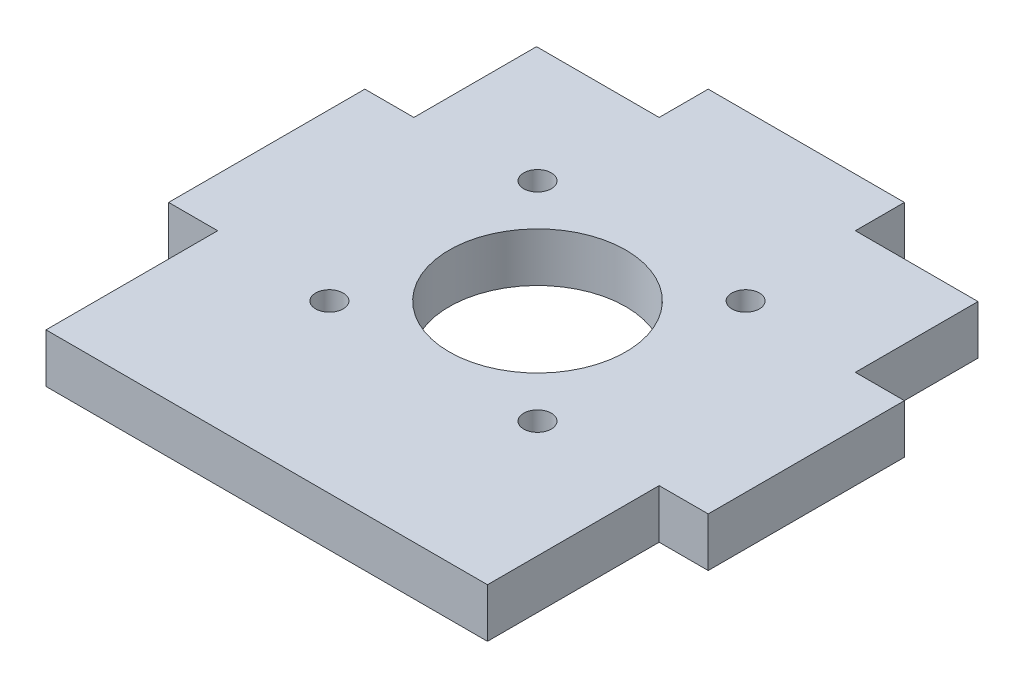
ISO-10303-21;
HEADER;
FILE_DESCRIPTION(('STEP AP214'),'2;1');
FILE_NAME('part.step','',(''),(''),'','','');
FILE_SCHEMA(('AUTOMOTIVE_DESIGN { 1 0 10303 214 1 1 1 1 }'));
ENDSEC;
DATA;
#1=APPLICATION_CONTEXT('core data for automotive mechanical design processes');
#2=APPLICATION_PROTOCOL_DEFINITION('international standard','automotive_design',2000,#1);
#3=PRODUCT_CONTEXT('',#1,'mechanical');
#4=PRODUCT('Part','Part','',(#3));
#5=PRODUCT_RELATED_PRODUCT_CATEGORY('part','',(#4));
#6=PRODUCT_DEFINITION_FORMATION('','',#4);
#7=PRODUCT_DEFINITION_CONTEXT('part definition',#1,'design');
#8=PRODUCT_DEFINITION('design','',#6,#7);
#9=PRODUCT_DEFINITION_SHAPE('','',#8);
#10=(LENGTH_UNIT() NAMED_UNIT(*) SI_UNIT(.MILLI.,.METRE.));
#11=(NAMED_UNIT(*) PLANE_ANGLE_UNIT() SI_UNIT($,.RADIAN.));
#12=(NAMED_UNIT(*) SI_UNIT($,.STERADIAN.) SOLID_ANGLE_UNIT());
#13=UNCERTAINTY_MEASURE_WITH_UNIT(LENGTH_MEASURE(1.E-05),#10,'distance_accuracy_value','');
#14=(GEOMETRIC_REPRESENTATION_CONTEXT(3) GLOBAL_UNCERTAINTY_ASSIGNED_CONTEXT((#13)) GLOBAL_UNIT_ASSIGNED_CONTEXT((#10,
#11,#12)) REPRESENTATION_CONTEXT('',''));
#15=CARTESIAN_POINT('',(0.,0.,0.));
#16=DIRECTION('',(0.,0.,1.));
#17=DIRECTION('',(1.,0.,0.));
#18=AXIS2_PLACEMENT_3D('',#15,#16,#17);
#19=CARTESIAN_POINT('',(6.35,6.35,-47.625));
#20=DIRECTION('',(0.,-1.,0.));
#21=DIRECTION('',(0.,0.,-1.));
#22=AXIS2_PLACEMENT_3D('',#19,#20,#21);
#23=PLANE('',#22);
#24=CARTESIAN_POINT('',(48.3953841816037,6.35,-21.5816158183963));
#25=DIRECTION('',(0.,1.,0.));
#26=DIRECTION('',(0.,0.,1.));
#27=AXIS2_PLACEMENT_3D('',#24,#25,#26);
#28=CIRCLE('',#27,1.78593749999999);
#29=CARTESIAN_POINT('',(48.3953841816037,6.35,-19.7956783183963));
#30=VERTEX_POINT('',#29);
#31=EDGE_CURVE('E346',#30,#30,#28,.T.);
#32=ORIENTED_EDGE('',*,*,#31,.F.);
#33=EDGE_LOOP('',(#32));
#34=FACE_BOUND('',#33,.T.);
#35=CARTESIAN_POINT('',(21.4546158183963,6.35,-48.5223841816037));
#36=DIRECTION('',(0.,1.,0.));
#37=DIRECTION('',(0.,0.,1.));
#38=AXIS2_PLACEMENT_3D('',#35,#36,#37);
#39=CIRCLE('',#38,1.78593749999999);
#40=CARTESIAN_POINT('',(21.4546158183963,6.35,-46.7364466816037));
#41=VERTEX_POINT('',#40);
#42=EDGE_CURVE('E358',#41,#41,#39,.T.);
#43=ORIENTED_EDGE('',*,*,#42,.F.);
#44=EDGE_LOOP('',(#43));
#45=FACE_BOUND('',#44,.T.);
#46=DIRECTION('',(0.,0.,1.));
#47=VECTOR('',#46,1.);
#48=CARTESIAN_POINT('',(6.35000000000001,6.35,-63.5));
#49=LINE('',#48,#47);
#50=CARTESIAN_POINT('',(6.35000000000001,6.35,-63.5));
#51=VERTEX_POINT('',#50);
#52=CARTESIAN_POINT('',(6.35,6.35,-47.625));
#53=VERTEX_POINT('',#52);
#54=EDGE_CURVE('E207',#51,#53,#49,.T.);
#55=ORIENTED_EDGE('',*,*,#54,.T.);
#56=DIRECTION('',(-1.,0.,0.));
#57=VECTOR('',#56,1.);
#58=CARTESIAN_POINT('',(6.35,6.35,-47.625));
#59=LINE('',#58,#57);
#60=CARTESIAN_POINT('',(0.,6.35,-47.625));
#61=VERTEX_POINT('',#60);
#62=EDGE_CURVE('E115',#53,#61,#59,.T.);
#63=ORIENTED_EDGE('',*,*,#62,.T.);
#64=DIRECTION('',(0.,0.,1.));
#65=VECTOR('',#64,1.);
#66=CARTESIAN_POINT('',(0.,6.35,-47.625));
#67=LINE('',#66,#65);
#68=CARTESIAN_POINT('',(0.,6.35,-22.225));
#69=VERTEX_POINT('',#68);
#70=EDGE_CURVE('E246',#61,#69,#67,.T.);
#71=ORIENTED_EDGE('',*,*,#70,.T.);
#72=DIRECTION('',(1.,0.,0.));
#73=VECTOR('',#72,1.);
#74=CARTESIAN_POINT('',(0.,6.35,-22.225));
#75=LINE('',#74,#73);
#76=CARTESIAN_POINT('',(6.35000000000001,6.35,-22.225));
#77=VERTEX_POINT('',#76);
#78=EDGE_CURVE('E265',#69,#77,#75,.T.);
#79=ORIENTED_EDGE('',*,*,#78,.T.);
#80=DIRECTION('',(0.,0.,1.));
#81=VECTOR('',#80,1.);
#82=CARTESIAN_POINT('',(6.35000000000001,6.35,-22.225));
#83=LINE('',#82,#81);
#84=CARTESIAN_POINT('',(6.35000000000001,6.35,0.));
#85=VERTEX_POINT('',#84);
#86=EDGE_CURVE('E262',#77,#85,#83,.T.);
#87=ORIENTED_EDGE('',*,*,#86,.T.);
#88=DIRECTION('',(1.,0.,0.));
#89=VECTOR('',#88,1.);
#90=CARTESIAN_POINT('',(6.35000000000001,6.35,0.));
#91=LINE('',#90,#89);
#92=CARTESIAN_POINT('',(63.5,6.35,0.));
#93=VERTEX_POINT('',#92);
#94=EDGE_CURVE('E264',#85,#93,#91,.T.);
#95=ORIENTED_EDGE('',*,*,#94,.T.);
#96=DIRECTION('',(0.,0.,-1.));
#97=VECTOR('',#96,1.);
#98=CARTESIAN_POINT('',(63.5,6.35,0.));
#99=LINE('',#98,#97);
#100=CARTESIAN_POINT('',(63.5,6.35,-22.225));
#101=VERTEX_POINT('',#100);
#102=EDGE_CURVE('E267',#93,#101,#99,.T.);
#103=ORIENTED_EDGE('',*,*,#102,.T.);
#104=DIRECTION('',(1.,0.,0.));
#105=VECTOR('',#104,1.);
#106=CARTESIAN_POINT('',(63.5,6.35,-22.225));
#107=LINE('',#106,#105);
#108=CARTESIAN_POINT('',(69.85,6.35,-22.225));
#109=VERTEX_POINT('',#108);
#110=EDGE_CURVE('E273',#101,#109,#107,.T.);
#111=ORIENTED_EDGE('',*,*,#110,.T.);
#112=DIRECTION('',(0.,0.,-1.));
#113=VECTOR('',#112,1.);
#114=CARTESIAN_POINT('',(69.85,6.35,-22.225));
#115=LINE('',#114,#113);
#116=CARTESIAN_POINT('',(69.85,6.35,-47.625));
#117=VERTEX_POINT('',#116);
#118=EDGE_CURVE('E275',#109,#117,#115,.T.);
#119=ORIENTED_EDGE('',*,*,#118,.T.);
#120=DIRECTION('',(-1.,0.,0.));
#121=VECTOR('',#120,1.);
#122=CARTESIAN_POINT('',(69.85,6.35,-47.625));
#123=LINE('',#122,#121);
#124=CARTESIAN_POINT('',(63.5,6.35,-47.625));
#125=VERTEX_POINT('',#124);
#126=EDGE_CURVE('E277',#117,#125,#123,.T.);
#127=ORIENTED_EDGE('',*,*,#126,.T.);
#128=DIRECTION('',(0.,0.,-1.));
#129=VECTOR('',#128,1.);
#130=CARTESIAN_POINT('',(63.5,6.35,-47.625));
#131=LINE('',#130,#129);
#132=CARTESIAN_POINT('',(63.5,6.35,-63.5));
#133=VERTEX_POINT('',#132);
#134=EDGE_CURVE('E279',#125,#133,#131,.T.);
#135=ORIENTED_EDGE('',*,*,#134,.T.);
#136=DIRECTION('',(-1.,0.,0.));
#137=VECTOR('',#136,1.);
#138=CARTESIAN_POINT('',(63.5,6.35,-63.5));
#139=LINE('',#138,#137);
#140=CARTESIAN_POINT('',(47.625,6.35,-63.5));
#141=VERTEX_POINT('',#140);
#142=EDGE_CURVE('E281',#133,#141,#139,.T.);
#143=ORIENTED_EDGE('',*,*,#142,.T.);
#144=DIRECTION('',(0.,0.,-1.));
#145=VECTOR('',#144,1.);
#146=CARTESIAN_POINT('',(47.625,6.35,-63.5));
#147=LINE('',#146,#145);
#148=CARTESIAN_POINT('',(47.625,6.35,-69.85));
#149=VERTEX_POINT('',#148);
#150=EDGE_CURVE('E158',#141,#149,#147,.T.);
#151=ORIENTED_EDGE('',*,*,#150,.T.);
#152=DIRECTION('',(-1.,0.,0.));
#153=VECTOR('',#152,1.);
#154=CARTESIAN_POINT('',(47.625,6.35,-69.85));
#155=LINE('',#154,#153);
#156=CARTESIAN_POINT('',(22.225,6.35,-69.85));
#157=VERTEX_POINT('',#156);
#158=EDGE_CURVE('E152',#149,#157,#155,.T.);
#159=ORIENTED_EDGE('',*,*,#158,.T.);
#160=DIRECTION('',(0.,0.,1.));
#161=VECTOR('',#160,1.);
#162=CARTESIAN_POINT('',(22.225,6.35,-69.85));
#163=LINE('',#162,#161);
#164=CARTESIAN_POINT('',(22.225,6.35,-63.5));
#165=VERTEX_POINT('',#164);
#166=EDGE_CURVE('E156',#157,#165,#163,.T.);
#167=ORIENTED_EDGE('',*,*,#166,.T.);
#168=DIRECTION('',(-1.,0.,0.));
#169=VECTOR('',#168,1.);
#170=CARTESIAN_POINT('',(22.225,6.35,-63.5));
#171=LINE('',#170,#169);
#172=EDGE_CURVE('E48',#165,#51,#171,.T.);
#173=ORIENTED_EDGE('',*,*,#172,.T.);
#174=EDGE_LOOP('',(#55,#63,#71,#79,#87,#95,#103,#111,#119,#127,#135,#143,#151,#159,#167,#173));
#175=FACE_BOUND('',#174,.T.);
#176=CARTESIAN_POINT('',(34.925,6.35,-35.052));
#177=DIRECTION('',(0.,1.,0.));
#178=DIRECTION('',(0.,0.,1.));
#179=AXIS2_PLACEMENT_3D('',#176,#177,#178);
#180=CIRCLE('',#179,11.43);
#181=CARTESIAN_POINT('',(34.925,6.35,-23.622));
#182=VERTEX_POINT('',#181);
#183=EDGE_CURVE('E180',#182,#182,#180,.T.);
#184=ORIENTED_EDGE('',*,*,#183,.F.);
#185=EDGE_LOOP('',(#184));
#186=FACE_BOUND('',#185,.T.);
#187=CARTESIAN_POINT('',(48.3953841816037,6.35,-48.5223841816037));
#188=DIRECTION('',(0.,1.,0.));
#189=DIRECTION('',(0.,0.,1.));
#190=AXIS2_PLACEMENT_3D('',#187,#188,#189);
#191=CIRCLE('',#190,1.78593749999999);
#192=CARTESIAN_POINT('',(48.3953841816037,6.35,-46.7364466816037));
#193=VERTEX_POINT('',#192);
#194=EDGE_CURVE('E352',#193,#193,#191,.T.);
#195=ORIENTED_EDGE('',*,*,#194,.F.);
#196=EDGE_LOOP('',(#195));
#197=FACE_BOUND('',#196,.T.);
#198=CARTESIAN_POINT('',(21.4546158183963,6.35,-21.5816158183963));
#199=DIRECTION('',(0.,1.,0.));
#200=DIRECTION('',(0.,0.,1.));
#201=AXIS2_PLACEMENT_3D('',#198,#199,#200);
#202=CIRCLE('',#201,1.78593749999999);
#203=CARTESIAN_POINT('',(21.4546158183963,6.35,-19.7956783183963));
#204=VERTEX_POINT('',#203);
#205=EDGE_CURVE('E337',#204,#204,#202,.T.);
#206=ORIENTED_EDGE('',*,*,#205,.F.);
#207=EDGE_LOOP('',(#206));
#208=FACE_BOUND('',#207,.T.);
#209=ADVANCED_FACE('F31',(#34,#45,#175,#186,#197,#208),#23,.F.);
#210=CARTESIAN_POINT('',(6.35,0.,-47.625));
#211=DIRECTION('',(0.,-1.,0.));
#212=DIRECTION('',(0.,0.,-1.));
#213=AXIS2_PLACEMENT_3D('',#210,#211,#212);
#214=PLANE('',#213);
#215=CARTESIAN_POINT('',(48.3953841816037,0.,-21.5816158183963));
#216=DIRECTION('',(0.,1.,0.));
#217=DIRECTION('',(0.,0.,1.));
#218=AXIS2_PLACEMENT_3D('',#215,#216,#217);
#219=CIRCLE('',#218,1.78593749999999);
#220=CARTESIAN_POINT('',(48.3953841816037,0.,-19.7956783183963));
#221=VERTEX_POINT('',#220);
#222=EDGE_CURVE('E343',#221,#221,#219,.T.);
#223=ORIENTED_EDGE('',*,*,#222,.T.);
#224=EDGE_LOOP('',(#223));
#225=FACE_BOUND('',#224,.T.);
#226=CARTESIAN_POINT('',(21.4546158183963,0.,-48.5223841816037));
#227=DIRECTION('',(0.,1.,0.));
#228=DIRECTION('',(0.,0.,1.));
#229=AXIS2_PLACEMENT_3D('',#226,#227,#228);
#230=CIRCLE('',#229,1.78593749999999);
#231=CARTESIAN_POINT('',(21.4546158183963,0.,-46.7364466816037));
#232=VERTEX_POINT('',#231);
#233=EDGE_CURVE('E355',#232,#232,#230,.T.);
#234=ORIENTED_EDGE('',*,*,#233,.T.);
#235=EDGE_LOOP('',(#234));
#236=FACE_BOUND('',#235,.T.);
#237=DIRECTION('',(0.,0.,1.));
#238=VECTOR('',#237,1.);
#239=CARTESIAN_POINT('',(6.35000000000001,0.,-63.5));
#240=LINE('',#239,#238);
#241=CARTESIAN_POINT('',(6.35000000000001,0.,-63.5));
#242=VERTEX_POINT('',#241);
#243=CARTESIAN_POINT('',(6.35,0.,-47.625));
#244=VERTEX_POINT('',#243);
#245=EDGE_CURVE('E176',#242,#244,#240,.T.);
#246=ORIENTED_EDGE('',*,*,#245,.F.);
#247=DIRECTION('',(-1.,0.,0.));
#248=VECTOR('',#247,1.);
#249=CARTESIAN_POINT('',(22.225,0.,-63.5));
#250=LINE('',#249,#248);
#251=CARTESIAN_POINT('',(22.225,0.,-63.5));
#252=VERTEX_POINT('',#251);
#253=EDGE_CURVE('E107',#252,#242,#250,.T.);
#254=ORIENTED_EDGE('',*,*,#253,.F.);
#255=DIRECTION('',(0.,0.,1.));
#256=VECTOR('',#255,1.);
#257=CARTESIAN_POINT('',(22.225,0.,-69.85));
#258=LINE('',#257,#256);
#259=CARTESIAN_POINT('',(22.225,0.,-69.85));
#260=VERTEX_POINT('',#259);
#261=EDGE_CURVE('E101',#260,#252,#258,.T.);
#262=ORIENTED_EDGE('',*,*,#261,.F.);
#263=DIRECTION('',(-1.,0.,0.));
#264=VECTOR('',#263,1.);
#265=CARTESIAN_POINT('',(47.625,0.,-69.85));
#266=LINE('',#265,#264);
#267=CARTESIAN_POINT('',(47.625,0.,-69.85));
#268=VERTEX_POINT('',#267);
#269=EDGE_CURVE('E166',#268,#260,#266,.T.);
#270=ORIENTED_EDGE('',*,*,#269,.F.);
#271=DIRECTION('',(0.,0.,-1.));
#272=VECTOR('',#271,1.);
#273=CARTESIAN_POINT('',(47.625,0.,-63.5));
#274=LINE('',#273,#272);
#275=CARTESIAN_POINT('',(47.625,0.,-63.5));
#276=VERTEX_POINT('',#275);
#277=EDGE_CURVE('E202',#276,#268,#274,.T.);
#278=ORIENTED_EDGE('',*,*,#277,.F.);
#279=DIRECTION('',(-1.,0.,0.));
#280=VECTOR('',#279,1.);
#281=CARTESIAN_POINT('',(63.5,0.,-63.5));
#282=LINE('',#281,#280);
#283=CARTESIAN_POINT('',(63.5,0.,-63.5));
#284=VERTEX_POINT('',#283);
#285=EDGE_CURVE('E200',#284,#276,#282,.T.);
#286=ORIENTED_EDGE('',*,*,#285,.F.);
#287=DIRECTION('',(0.,0.,-1.));
#288=VECTOR('',#287,1.);
#289=CARTESIAN_POINT('',(63.5,0.,-47.625));
#290=LINE('',#289,#288);
#291=CARTESIAN_POINT('',(63.5,0.,-47.625));
#292=VERTEX_POINT('',#291);
#293=EDGE_CURVE('E198',#292,#284,#290,.T.);
#294=ORIENTED_EDGE('',*,*,#293,.F.);
#295=DIRECTION('',(-1.,0.,0.));
#296=VECTOR('',#295,1.);
#297=CARTESIAN_POINT('',(69.85,0.,-47.625));
#298=LINE('',#297,#296);
#299=CARTESIAN_POINT('',(69.85,0.,-47.625));
#300=VERTEX_POINT('',#299);
#301=EDGE_CURVE('E196',#300,#292,#298,.T.);
#302=ORIENTED_EDGE('',*,*,#301,.F.);
#303=DIRECTION('',(0.,0.,-1.));
#304=VECTOR('',#303,1.);
#305=CARTESIAN_POINT('',(69.85,0.,-22.225));
#306=LINE('',#305,#304);
#307=CARTESIAN_POINT('',(69.85,0.,-22.225));
#308=VERTEX_POINT('',#307);
#309=EDGE_CURVE('E194',#308,#300,#306,.T.);
#310=ORIENTED_EDGE('',*,*,#309,.F.);
#311=DIRECTION('',(1.,0.,0.));
#312=VECTOR('',#311,1.);
#313=CARTESIAN_POINT('',(63.5,0.,-22.225));
#314=LINE('',#313,#312);
#315=CARTESIAN_POINT('',(63.5,0.,-22.225));
#316=VERTEX_POINT('',#315);
#317=EDGE_CURVE('E192',#316,#308,#314,.T.);
#318=ORIENTED_EDGE('',*,*,#317,.F.);
#319=DIRECTION('',(0.,0.,-1.));
#320=VECTOR('',#319,1.);
#321=CARTESIAN_POINT('',(63.5,0.,0.));
#322=LINE('',#321,#320);
#323=CARTESIAN_POINT('',(63.5,0.,0.));
#324=VERTEX_POINT('',#323);
#325=EDGE_CURVE('E190',#324,#316,#322,.T.);
#326=ORIENTED_EDGE('',*,*,#325,.F.);
#327=DIRECTION('',(1.,0.,0.));
#328=VECTOR('',#327,1.);
#329=CARTESIAN_POINT('',(6.35000000000001,0.,0.));
#330=LINE('',#329,#328);
#331=CARTESIAN_POINT('',(6.35000000000001,0.,0.));
#332=VERTEX_POINT('',#331);
#333=EDGE_CURVE('E188',#332,#324,#330,.T.);
#334=ORIENTED_EDGE('',*,*,#333,.F.);
#335=DIRECTION('',(0.,0.,1.));
#336=VECTOR('',#335,1.);
#337=CARTESIAN_POINT('',(6.35000000000001,0.,-22.225));
#338=LINE('',#337,#336);
#339=CARTESIAN_POINT('',(6.35000000000001,0.,-22.225));
#340=VERTEX_POINT('',#339);
#341=EDGE_CURVE('E186',#340,#332,#338,.T.);
#342=ORIENTED_EDGE('',*,*,#341,.F.);
#343=DIRECTION('',(1.,0.,0.));
#344=VECTOR('',#343,1.);
#345=CARTESIAN_POINT('',(0.,0.,-22.225));
#346=LINE('',#345,#344);
#347=CARTESIAN_POINT('',(0.,0.,-22.225));
#348=VERTEX_POINT('',#347);
#349=EDGE_CURVE('E184',#348,#340,#346,.T.);
#350=ORIENTED_EDGE('',*,*,#349,.F.);
#351=DIRECTION('',(0.,0.,1.));
#352=VECTOR('',#351,1.);
#353=CARTESIAN_POINT('',(0.,0.,-47.625));
#354=LINE('',#353,#352);
#355=CARTESIAN_POINT('',(0.,0.,-47.625));
#356=VERTEX_POINT('',#355);
#357=EDGE_CURVE('E182',#356,#348,#354,.T.);
#358=ORIENTED_EDGE('',*,*,#357,.F.);
#359=DIRECTION('',(-1.,0.,0.));
#360=VECTOR('',#359,1.);
#361=CARTESIAN_POINT('',(6.35,0.,-47.625));
#362=LINE('',#361,#360);
#363=EDGE_CURVE('E179',#244,#356,#362,.T.);
#364=ORIENTED_EDGE('',*,*,#363,.F.);
#365=EDGE_LOOP('',(#246,#254,#262,#270,#278,#286,#294,#302,#310,#318,#326,#334,#342,#350,#358,#364));
#366=FACE_BOUND('',#365,.T.);
#367=CARTESIAN_POINT('',(34.925,0.,-35.052));
#368=DIRECTION('',(0.,1.,0.));
#369=DIRECTION('',(0.,0.,1.));
#370=AXIS2_PLACEMENT_3D('',#367,#368,#369);
#371=CIRCLE('',#370,11.43);
#372=CARTESIAN_POINT('',(34.925,0.,-23.622));
#373=VERTEX_POINT('',#372);
#374=EDGE_CURVE('E361',#373,#373,#371,.T.);
#375=ORIENTED_EDGE('',*,*,#374,.T.);
#376=EDGE_LOOP('',(#375));
#377=FACE_BOUND('',#376,.T.);
#378=CARTESIAN_POINT('',(48.3953841816037,0.,-48.5223841816037));
#379=DIRECTION('',(0.,1.,0.));
#380=DIRECTION('',(0.,0.,1.));
#381=AXIS2_PLACEMENT_3D('',#378,#379,#380);
#382=CIRCLE('',#381,1.78593749999999);
#383=CARTESIAN_POINT('',(48.3953841816037,0.,-46.7364466816037));
#384=VERTEX_POINT('',#383);
#385=EDGE_CURVE('E349',#384,#384,#382,.T.);
#386=ORIENTED_EDGE('',*,*,#385,.T.);
#387=EDGE_LOOP('',(#386));
#388=FACE_BOUND('',#387,.T.);
#389=CARTESIAN_POINT('',(21.4546158183963,0.,-21.5816158183963));
#390=DIRECTION('',(0.,1.,0.));
#391=DIRECTION('',(0.,0.,1.));
#392=AXIS2_PLACEMENT_3D('',#389,#390,#391);
#393=CIRCLE('',#392,1.78593749999999);
#394=CARTESIAN_POINT('',(21.4546158183963,0.,-19.7956783183963));
#395=VERTEX_POINT('',#394);
#396=EDGE_CURVE('E340',#395,#395,#393,.T.);
#397=ORIENTED_EDGE('',*,*,#396,.T.);
#398=EDGE_LOOP('',(#397));
#399=FACE_BOUND('',#398,.T.);
#400=ADVANCED_FACE('F250',(#225,#236,#366,#377,#388,#399),#214,.T.);
#401=CARTESIAN_POINT('',(6.35000000000001,6.35,-63.5));
#402=DIRECTION('',(1.,0.,0.));
#403=DIRECTION('',(0.,0.,-1.));
#404=AXIS2_PLACEMENT_3D('',#401,#402,#403);
#405=PLANE('',#404);
#406=ORIENTED_EDGE('',*,*,#245,.T.);
#407=DIRECTION('',(0.,-1.,0.));
#408=VECTOR('',#407,1.);
#409=CARTESIAN_POINT('',(6.35,6.35,-47.625));
#410=LINE('',#409,#408);
#411=EDGE_CURVE('E11',#53,#244,#410,.T.);
#412=ORIENTED_EDGE('',*,*,#411,.F.);
#413=ORIENTED_EDGE('',*,*,#54,.F.);
#414=DIRECTION('',(0.,-1.,0.));
#415=VECTOR('',#414,1.);
#416=CARTESIAN_POINT('',(6.35000000000001,6.35,-63.5));
#417=LINE('',#416,#415);
#418=EDGE_CURVE('E172',#51,#242,#417,.T.);
#419=ORIENTED_EDGE('',*,*,#418,.T.);
#420=EDGE_LOOP('',(#406,#412,#413,#419));
#421=FACE_BOUND('',#420,.T.);
#422=ADVANCED_FACE('F33',(#421),#405,.F.);
#423=CARTESIAN_POINT('',(6.35,6.35,-47.625));
#424=DIRECTION('',(0.,0.,1.));
#425=DIRECTION('',(1.,0.,0.));
#426=AXIS2_PLACEMENT_3D('',#423,#424,#425);
#427=PLANE('',#426);
#428=ORIENTED_EDGE('',*,*,#363,.T.);
#429=DIRECTION('',(0.,-1.,0.));
#430=VECTOR('',#429,1.);
#431=CARTESIAN_POINT('',(0.,6.35,-47.625));
#432=LINE('',#431,#430);
#433=EDGE_CURVE('E40',#61,#356,#432,.T.);
#434=ORIENTED_EDGE('',*,*,#433,.F.);
#435=ORIENTED_EDGE('',*,*,#62,.F.);
#436=ORIENTED_EDGE('',*,*,#411,.T.);
#437=EDGE_LOOP('',(#428,#434,#435,#436));
#438=FACE_BOUND('',#437,.T.);
#439=ADVANCED_FACE('F519',(#438),#427,.F.);
#440=CARTESIAN_POINT('',(0.,6.35,-47.625));
#441=DIRECTION('',(1.,0.,0.));
#442=DIRECTION('',(0.,0.,-1.));
#443=AXIS2_PLACEMENT_3D('',#440,#441,#442);
#444=PLANE('',#443);
#445=ORIENTED_EDGE('',*,*,#357,.T.);
#446=DIRECTION('',(0.,-1.,0.));
#447=VECTOR('',#446,1.);
#448=CARTESIAN_POINT('',(0.,6.35,-22.225));
#449=LINE('',#448,#447);
#450=EDGE_CURVE('E238',#69,#348,#449,.T.);
#451=ORIENTED_EDGE('',*,*,#450,.F.);
#452=ORIENTED_EDGE('',*,*,#70,.F.);
#453=ORIENTED_EDGE('',*,*,#433,.T.);
#454=EDGE_LOOP('',(#445,#451,#452,#453));
#455=FACE_BOUND('',#454,.T.);
#456=ADVANCED_FACE('F244',(#455),#444,.F.);
#457=CARTESIAN_POINT('',(0.,6.35,-22.225));
#458=DIRECTION('',(0.,0.,-1.));
#459=DIRECTION('',(-1.,0.,0.));
#460=AXIS2_PLACEMENT_3D('',#457,#458,#459);
#461=PLANE('',#460);
#462=ORIENTED_EDGE('',*,*,#349,.T.);
#463=DIRECTION('',(0.,-1.,0.));
#464=VECTOR('',#463,1.);
#465=CARTESIAN_POINT('',(6.35000000000001,6.35,-22.225));
#466=LINE('',#465,#464);
#467=EDGE_CURVE('E235',#77,#340,#466,.T.);
#468=ORIENTED_EDGE('',*,*,#467,.F.);
#469=ORIENTED_EDGE('',*,*,#78,.F.);
#470=ORIENTED_EDGE('',*,*,#450,.T.);
#471=EDGE_LOOP('',(#462,#468,#469,#470));
#472=FACE_BOUND('',#471,.T.);
#473=ADVANCED_FACE('F256',(#472),#461,.F.);
#474=CARTESIAN_POINT('',(6.35000000000001,6.35,-22.225));
#475=DIRECTION('',(1.,0.,0.));
#476=DIRECTION('',(0.,0.,-1.));
#477=AXIS2_PLACEMENT_3D('',#474,#475,#476);
#478=PLANE('',#477);
#479=ORIENTED_EDGE('',*,*,#341,.T.);
#480=DIRECTION('',(0.,-1.,0.));
#481=VECTOR('',#480,1.);
#482=CARTESIAN_POINT('',(6.35000000000001,6.35,0.));
#483=LINE('',#482,#481);
#484=EDGE_CURVE('E232',#85,#332,#483,.T.);
#485=ORIENTED_EDGE('',*,*,#484,.F.);
#486=ORIENTED_EDGE('',*,*,#86,.F.);
#487=ORIENTED_EDGE('',*,*,#467,.T.);
#488=EDGE_LOOP('',(#479,#485,#486,#487));
#489=FACE_BOUND('',#488,.T.);
#490=ADVANCED_FACE('F260',(#489),#478,.F.);
#491=CARTESIAN_POINT('',(6.35000000000001,6.35,0.));
#492=DIRECTION('',(0.,0.,-1.));
#493=DIRECTION('',(-1.,0.,0.));
#494=AXIS2_PLACEMENT_3D('',#491,#492,#493);
#495=PLANE('',#494);
#496=ORIENTED_EDGE('',*,*,#333,.T.);
#497=DIRECTION('',(0.,-1.,0.));
#498=VECTOR('',#497,1.);
#499=CARTESIAN_POINT('',(63.5,6.35,0.));
#500=LINE('',#499,#498);
#501=EDGE_CURVE('E229',#93,#324,#500,.T.);
#502=ORIENTED_EDGE('',*,*,#501,.F.);
#503=ORIENTED_EDGE('',*,*,#94,.F.);
#504=ORIENTED_EDGE('',*,*,#484,.T.);
#505=EDGE_LOOP('',(#496,#502,#503,#504));
#506=FACE_BOUND('',#505,.T.);
#507=ADVANCED_FACE('F484',(#506),#495,.F.);
#508=CARTESIAN_POINT('',(63.5,6.35,0.));
#509=DIRECTION('',(-1.,0.,0.));
#510=DIRECTION('',(0.,0.,1.));
#511=AXIS2_PLACEMENT_3D('',#508,#509,#510);
#512=PLANE('',#511);
#513=ORIENTED_EDGE('',*,*,#325,.T.);
#514=DIRECTION('',(0.,-1.,0.));
#515=VECTOR('',#514,1.);
#516=CARTESIAN_POINT('',(63.5,6.35,-22.225));
#517=LINE('',#516,#515);
#518=EDGE_CURVE('E226',#101,#316,#517,.T.);
#519=ORIENTED_EDGE('',*,*,#518,.F.);
#520=ORIENTED_EDGE('',*,*,#102,.F.);
#521=ORIENTED_EDGE('',*,*,#501,.T.);
#522=EDGE_LOOP('',(#513,#519,#520,#521));
#523=FACE_BOUND('',#522,.T.);
#524=ADVANCED_FACE('F474',(#523),#512,.F.);
#525=CARTESIAN_POINT('',(63.5,6.35,-22.225));
#526=DIRECTION('',(0.,0.,-1.));
#527=DIRECTION('',(-1.,0.,0.));
#528=AXIS2_PLACEMENT_3D('',#525,#526,#527);
#529=PLANE('',#528);
#530=ORIENTED_EDGE('',*,*,#317,.T.);
#531=DIRECTION('',(0.,-1.,0.));
#532=VECTOR('',#531,1.);
#533=CARTESIAN_POINT('',(69.85,6.35,-22.225));
#534=LINE('',#533,#532);
#535=EDGE_CURVE('E223',#109,#308,#534,.T.);
#536=ORIENTED_EDGE('',*,*,#535,.F.);
#537=ORIENTED_EDGE('',*,*,#110,.F.);
#538=ORIENTED_EDGE('',*,*,#518,.T.);
#539=EDGE_LOOP('',(#530,#536,#537,#538));
#540=FACE_BOUND('',#539,.T.);
#541=ADVANCED_FACE('F464',(#540),#529,.F.);
#542=CARTESIAN_POINT('',(69.85,6.35,-22.225));
#543=DIRECTION('',(-1.,0.,0.));
#544=DIRECTION('',(0.,0.,1.));
#545=AXIS2_PLACEMENT_3D('',#542,#543,#544);
#546=PLANE('',#545);
#547=ORIENTED_EDGE('',*,*,#309,.T.);
#548=DIRECTION('',(0.,-1.,0.));
#549=VECTOR('',#548,1.);
#550=CARTESIAN_POINT('',(69.85,6.35,-47.625));
#551=LINE('',#550,#549);
#552=EDGE_CURVE('E220',#117,#300,#551,.T.);
#553=ORIENTED_EDGE('',*,*,#552,.F.);
#554=ORIENTED_EDGE('',*,*,#118,.F.);
#555=ORIENTED_EDGE('',*,*,#535,.T.);
#556=EDGE_LOOP('',(#547,#553,#554,#555));
#557=FACE_BOUND('',#556,.T.);
#558=ADVANCED_FACE('F454',(#557),#546,.F.);
#559=CARTESIAN_POINT('',(69.85,6.35,-47.625));
#560=DIRECTION('',(0.,0.,1.));
#561=DIRECTION('',(1.,0.,0.));
#562=AXIS2_PLACEMENT_3D('',#559,#560,#561);
#563=PLANE('',#562);
#564=ORIENTED_EDGE('',*,*,#301,.T.);
#565=DIRECTION('',(0.,-1.,0.));
#566=VECTOR('',#565,1.);
#567=CARTESIAN_POINT('',(63.5,6.35,-47.625));
#568=LINE('',#567,#566);
#569=EDGE_CURVE('E217',#125,#292,#568,.T.);
#570=ORIENTED_EDGE('',*,*,#569,.F.);
#571=ORIENTED_EDGE('',*,*,#126,.F.);
#572=ORIENTED_EDGE('',*,*,#552,.T.);
#573=EDGE_LOOP('',(#564,#570,#571,#572));
#574=FACE_BOUND('',#573,.T.);
#575=ADVANCED_FACE('F444',(#574),#563,.F.);
#576=CARTESIAN_POINT('',(63.5,6.35,-47.625));
#577=DIRECTION('',(-1.,0.,0.));
#578=DIRECTION('',(0.,0.,1.));
#579=AXIS2_PLACEMENT_3D('',#576,#577,#578);
#580=PLANE('',#579);
#581=ORIENTED_EDGE('',*,*,#293,.T.);
#582=DIRECTION('',(0.,-1.,0.));
#583=VECTOR('',#582,1.);
#584=CARTESIAN_POINT('',(63.5,6.35,-63.5));
#585=LINE('',#584,#583);
#586=EDGE_CURVE('E214',#133,#284,#585,.T.);
#587=ORIENTED_EDGE('',*,*,#586,.F.);
#588=ORIENTED_EDGE('',*,*,#134,.F.);
#589=ORIENTED_EDGE('',*,*,#569,.T.);
#590=EDGE_LOOP('',(#581,#587,#588,#589));
#591=FACE_BOUND('',#590,.T.);
#592=ADVANCED_FACE('F435',(#591),#580,.F.);
#593=CARTESIAN_POINT('',(63.5,6.35,-63.5));
#594=DIRECTION('',(0.,0.,1.));
#595=DIRECTION('',(1.,0.,0.));
#596=AXIS2_PLACEMENT_3D('',#593,#594,#595);
#597=PLANE('',#596);
#598=ORIENTED_EDGE('',*,*,#285,.T.);
#599=DIRECTION('',(0.,-1.,0.));
#600=VECTOR('',#599,1.);
#601=CARTESIAN_POINT('',(47.625,6.35,-63.5));
#602=LINE('',#601,#600);
#603=EDGE_CURVE('E211',#141,#276,#602,.T.);
#604=ORIENTED_EDGE('',*,*,#603,.F.);
#605=ORIENTED_EDGE('',*,*,#142,.F.);
#606=ORIENTED_EDGE('',*,*,#586,.T.);
#607=EDGE_LOOP('',(#598,#604,#605,#606));
#608=FACE_BOUND('',#607,.T.);
#609=ADVANCED_FACE('F287',(#608),#597,.F.);
#610=CARTESIAN_POINT('',(47.625,6.35,-63.5));
#611=DIRECTION('',(-1.,0.,0.));
#612=DIRECTION('',(0.,0.,1.));
#613=AXIS2_PLACEMENT_3D('',#610,#611,#612);
#614=PLANE('',#613);
#615=ORIENTED_EDGE('',*,*,#277,.T.);
#616=DIRECTION('',(0.,-1.,0.));
#617=VECTOR('',#616,1.);
#618=CARTESIAN_POINT('',(47.625,6.35,-69.85));
#619=LINE('',#618,#617);
#620=EDGE_CURVE('E167',#149,#268,#619,.T.);
#621=ORIENTED_EDGE('',*,*,#620,.F.);
#622=ORIENTED_EDGE('',*,*,#150,.F.);
#623=ORIENTED_EDGE('',*,*,#603,.T.);
#624=EDGE_LOOP('',(#615,#621,#622,#623));
#625=FACE_BOUND('',#624,.T.);
#626=ADVANCED_FACE('F291',(#625),#614,.F.);
#627=CARTESIAN_POINT('',(47.625,6.35,-69.85));
#628=DIRECTION('',(0.,0.,1.));
#629=DIRECTION('',(1.,0.,0.));
#630=AXIS2_PLACEMENT_3D('',#627,#628,#629);
#631=PLANE('',#630);
#632=ORIENTED_EDGE('',*,*,#269,.T.);
#633=DIRECTION('',(0.,-1.,0.));
#634=VECTOR('',#633,1.);
#635=CARTESIAN_POINT('',(22.225,6.35,-69.85));
#636=LINE('',#635,#634);
#637=EDGE_CURVE('E163',#157,#260,#636,.T.);
#638=ORIENTED_EDGE('',*,*,#637,.F.);
#639=ORIENTED_EDGE('',*,*,#158,.F.);
#640=ORIENTED_EDGE('',*,*,#620,.T.);
#641=EDGE_LOOP('',(#632,#638,#639,#640));
#642=FACE_BOUND('',#641,.T.);
#643=ADVANCED_FACE('F164',(#642),#631,.F.);
#644=CARTESIAN_POINT('',(22.225,6.35,-69.85));
#645=DIRECTION('',(1.,0.,0.));
#646=DIRECTION('',(0.,0.,-1.));
#647=AXIS2_PLACEMENT_3D('',#644,#645,#646);
#648=PLANE('',#647);
#649=ORIENTED_EDGE('',*,*,#261,.T.);
#650=DIRECTION('',(0.,-1.,0.));
#651=VECTOR('',#650,1.);
#652=CARTESIAN_POINT('',(22.225,6.35,-63.5));
#653=LINE('',#652,#651);
#654=EDGE_CURVE('E168',#165,#252,#653,.T.);
#655=ORIENTED_EDGE('',*,*,#654,.F.);
#656=ORIENTED_EDGE('',*,*,#166,.F.);
#657=ORIENTED_EDGE('',*,*,#637,.T.);
#658=EDGE_LOOP('',(#649,#655,#656,#657));
#659=FACE_BOUND('',#658,.T.);
#660=ADVANCED_FACE('F170',(#659),#648,.F.);
#661=CARTESIAN_POINT('',(22.225,6.35,-63.5));
#662=DIRECTION('',(0.,0.,1.));
#663=DIRECTION('',(1.,0.,0.));
#664=AXIS2_PLACEMENT_3D('',#661,#662,#663);
#665=PLANE('',#664);
#666=ORIENTED_EDGE('',*,*,#253,.T.);
#667=ORIENTED_EDGE('',*,*,#418,.F.);
#668=ORIENTED_EDGE('',*,*,#172,.F.);
#669=ORIENTED_EDGE('',*,*,#654,.T.);
#670=EDGE_LOOP('',(#666,#667,#668,#669));
#671=FACE_BOUND('',#670,.T.);
#672=ADVANCED_FACE('F295',(#671),#665,.F.);
#673=CARTESIAN_POINT('',(34.925,6.35,-35.052));
#674=DIRECTION('',(0.,-1.,0.));
#675=DIRECTION('',(0.,0.,-1.));
#676=AXIS2_PLACEMENT_3D('',#673,#674,#675);
#677=CYLINDRICAL_SURFACE('',#676,11.43);
#678=ORIENTED_EDGE('',*,*,#183,.T.);
#679=EDGE_LOOP('',(#678));
#680=FACE_BOUND('',#679,.T.);
#681=ORIENTED_EDGE('',*,*,#374,.F.);
#682=EDGE_LOOP('',(#681));
#683=FACE_BOUND('',#682,.T.);
#684=ADVANCED_FACE('F297',(#680,#683),#677,.F.);
#685=CARTESIAN_POINT('',(21.4546158183963,6.35,-48.5223841816037));
#686=DIRECTION('',(0.,-1.,0.));
#687=DIRECTION('',(0.,0.,-1.));
#688=AXIS2_PLACEMENT_3D('',#685,#686,#687);
#689=CYLINDRICAL_SURFACE('',#688,1.78593749999999);
#690=ORIENTED_EDGE('',*,*,#42,.T.);
#691=EDGE_LOOP('',(#690));
#692=FACE_BOUND('',#691,.T.);
#693=ORIENTED_EDGE('',*,*,#233,.F.);
#694=EDGE_LOOP('',(#693));
#695=FACE_BOUND('',#694,.T.);
#696=ADVANCED_FACE('F303',(#692,#695),#689,.F.);
#697=CARTESIAN_POINT('',(48.3953841816037,6.35,-48.5223841816037));
#698=DIRECTION('',(0.,-1.,0.));
#699=DIRECTION('',(0.,0.,-1.));
#700=AXIS2_PLACEMENT_3D('',#697,#698,#699);
#701=CYLINDRICAL_SURFACE('',#700,1.78593749999999);
#702=ORIENTED_EDGE('',*,*,#194,.T.);
#703=EDGE_LOOP('',(#702));
#704=FACE_BOUND('',#703,.T.);
#705=ORIENTED_EDGE('',*,*,#385,.F.);
#706=EDGE_LOOP('',(#705));
#707=FACE_BOUND('',#706,.T.);
#708=ADVANCED_FACE('F320',(#704,#707),#701,.F.);
#709=CARTESIAN_POINT('',(48.3953841816037,6.35,-21.5816158183963));
#710=DIRECTION('',(0.,-1.,0.));
#711=DIRECTION('',(0.,0.,-1.));
#712=AXIS2_PLACEMENT_3D('',#709,#710,#711);
#713=CYLINDRICAL_SURFACE('',#712,1.78593749999999);
#714=ORIENTED_EDGE('',*,*,#31,.T.);
#715=EDGE_LOOP('',(#714));
#716=FACE_BOUND('',#715,.T.);
#717=ORIENTED_EDGE('',*,*,#222,.F.);
#718=EDGE_LOOP('',(#717));
#719=FACE_BOUND('',#718,.T.);
#720=ADVANCED_FACE('F324',(#716,#719),#713,.F.);
#721=CARTESIAN_POINT('',(21.4546158183963,6.35,-21.5816158183963));
#722=DIRECTION('',(0.,-1.,0.));
#723=DIRECTION('',(0.,0.,-1.));
#724=AXIS2_PLACEMENT_3D('',#721,#722,#723);
#725=CYLINDRICAL_SURFACE('',#724,1.78593749999999);
#726=ORIENTED_EDGE('',*,*,#205,.T.);
#727=EDGE_LOOP('',(#726));
#728=FACE_BOUND('',#727,.T.);
#729=ORIENTED_EDGE('',*,*,#396,.F.);
#730=EDGE_LOOP('',(#729));
#731=FACE_BOUND('',#730,.T.);
#732=ADVANCED_FACE('F328',(#728,#731),#725,.F.);
#733=CLOSED_SHELL('',(#209,#400,#422,#439,#456,#473,#490,#507,#524,#541,#558,#575,#592,#609,
#626,#643,#660,#672,#684,#696,#708,#720,#732));
#734=MANIFOLD_SOLID_BREP('B2',#733);
#735=ADVANCED_BREP_SHAPE_REPRESENTATION('',(#18,#734),#14);
#736=SHAPE_DEFINITION_REPRESENTATION(#9,#735);
ENDSEC;
END-ISO-10303-21;
